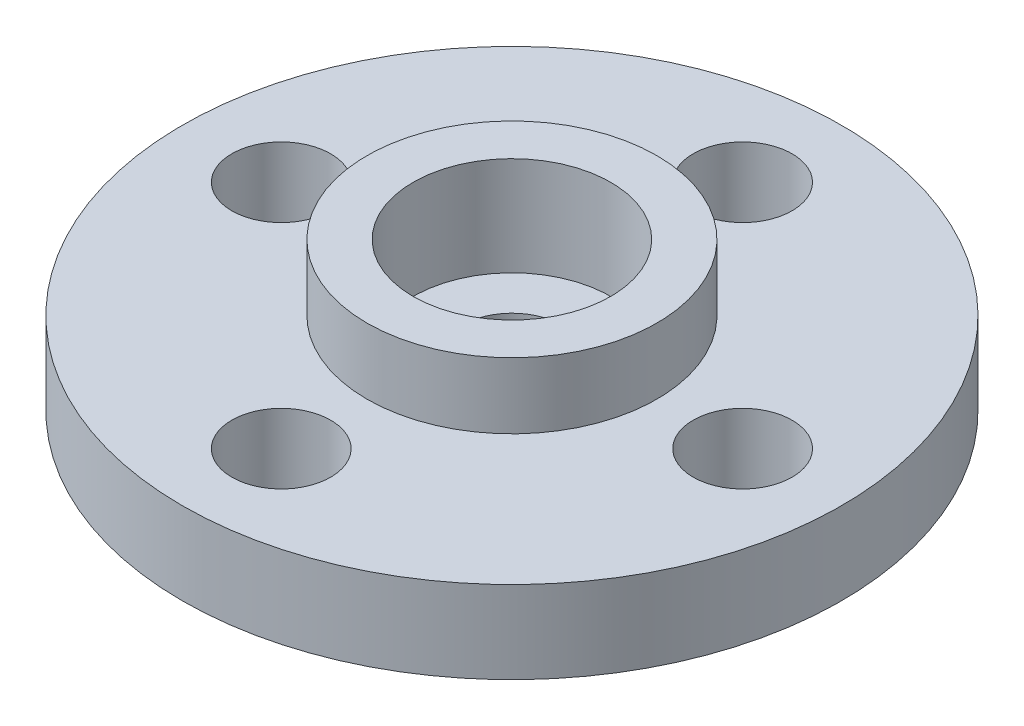
ISO-10303-21;
HEADER;
FILE_DESCRIPTION(('STEP AP214'),'2;1');
FILE_NAME('part.step','',(''),(''),'','','');
FILE_SCHEMA(('AUTOMOTIVE_DESIGN { 1 0 10303 214 1 1 1 1 }'));
ENDSEC;
DATA;
#1=APPLICATION_CONTEXT('core data for automotive mechanical design processes');
#2=APPLICATION_PROTOCOL_DEFINITION('international standard','automotive_design',2000,#1);
#3=PRODUCT_CONTEXT('',#1,'mechanical');
#4=PRODUCT('Part','Part','',(#3));
#5=PRODUCT_RELATED_PRODUCT_CATEGORY('part','',(#4));
#6=PRODUCT_DEFINITION_FORMATION('','',#4);
#7=PRODUCT_DEFINITION_CONTEXT('part definition',#1,'design');
#8=PRODUCT_DEFINITION('design','',#6,#7);
#9=PRODUCT_DEFINITION_SHAPE('','',#8);
#10=(LENGTH_UNIT() NAMED_UNIT(*) SI_UNIT(.MILLI.,.METRE.));
#11=(NAMED_UNIT(*) PLANE_ANGLE_UNIT() SI_UNIT($,.RADIAN.));
#12=(NAMED_UNIT(*) SI_UNIT($,.STERADIAN.) SOLID_ANGLE_UNIT());
#13=UNCERTAINTY_MEASURE_WITH_UNIT(LENGTH_MEASURE(1.E-05),#10,'distance_accuracy_value','');
#14=(GEOMETRIC_REPRESENTATION_CONTEXT(3) GLOBAL_UNCERTAINTY_ASSIGNED_CONTEXT((#13)) GLOBAL_UNIT_ASSIGNED_CONTEXT((#10,
#11,#12)) REPRESENTATION_CONTEXT('',''));
#15=CARTESIAN_POINT('',(0.,0.,0.));
#16=DIRECTION('',(0.,0.,1.));
#17=DIRECTION('',(1.,0.,0.));
#18=AXIS2_PLACEMENT_3D('',#15,#16,#17);
#19=CARTESIAN_POINT('',(0.,0.,0.));
#20=DIRECTION('',(0.,1.,0.));
#21=DIRECTION('',(0.,0.,1.));
#22=AXIS2_PLACEMENT_3D('',#19,#20,#21);
#23=CYLINDRICAL_SURFACE('',#22,1.5);
#24=CARTESIAN_POINT('',(0.,0.,0.));
#25=DIRECTION('',(0.,1.,0.));
#26=DIRECTION('',(0.,0.,1.));
#27=AXIS2_PLACEMENT_3D('',#24,#25,#26);
#28=CIRCLE('',#27,1.5);
#29=CARTESIAN_POINT('',(0.,0.,1.5));
#30=VERTEX_POINT('',#29);
#31=EDGE_CURVE('E49',#30,#30,#28,.T.);
#32=ORIENTED_EDGE('',*,*,#31,.F.);
#33=EDGE_LOOP('',(#32));
#34=FACE_BOUND('',#33,.T.);
#35=CARTESIAN_POINT('',(0.,1.5,0.));
#36=DIRECTION('',(0.,1.,0.));
#37=DIRECTION('',(0.,0.,1.));
#38=AXIS2_PLACEMENT_3D('',#35,#36,#37);
#39=CIRCLE('',#38,1.5);
#40=CARTESIAN_POINT('',(0.,1.5,1.5));
#41=VERTEX_POINT('',#40);
#42=EDGE_CURVE('E35',#41,#41,#39,.F.);
#43=ORIENTED_EDGE('',*,*,#42,.F.);
#44=EDGE_LOOP('',(#43));
#45=FACE_BOUND('',#44,.T.);
#46=ADVANCED_FACE('F31',(#34,#45),#23,.F.);
#47=CARTESIAN_POINT('',(0.,2.5,0.));
#48=DIRECTION('',(0.,1.,0.));
#49=DIRECTION('',(0.,0.,1.));
#50=AXIS2_PLACEMENT_3D('',#47,#48,#49);
#51=PLANE('',#50);
#52=CARTESIAN_POINT('',(0.,2.5,0.));
#53=DIRECTION('',(0.,1.,0.));
#54=DIRECTION('',(0.,0.,1.));
#55=AXIS2_PLACEMENT_3D('',#52,#53,#54);
#56=CIRCLE('',#55,10.);
#57=CARTESIAN_POINT('',(0.,2.5,10.));
#58=VERTEX_POINT('',#57);
#59=EDGE_CURVE('E10',#58,#58,#56,.T.);
#60=ORIENTED_EDGE('',*,*,#59,.T.);
#61=EDGE_LOOP('',(#60));
#62=FACE_BOUND('',#61,.T.);
#63=CARTESIAN_POINT('',(0.,2.5,-7.));
#64=DIRECTION('',(0.,1.,0.));
#65=DIRECTION('',(0.,0.,1.));
#66=AXIS2_PLACEMENT_3D('',#63,#64,#65);
#67=CIRCLE('',#66,1.5);
#68=CARTESIAN_POINT('',(0.,2.5,-5.5));
#69=VERTEX_POINT('',#68);
#70=EDGE_CURVE('E46',#69,#69,#67,.T.);
#71=ORIENTED_EDGE('',*,*,#70,.F.);
#72=EDGE_LOOP('',(#71));
#73=FACE_BOUND('',#72,.T.);
#74=CARTESIAN_POINT('',(7.,2.5,0.));
#75=DIRECTION('',(0.,1.,0.));
#76=DIRECTION('',(0.,0.,1.));
#77=AXIS2_PLACEMENT_3D('',#74,#75,#76);
#78=CIRCLE('',#77,1.5);
#79=CARTESIAN_POINT('',(7.,2.5,1.5));
#80=VERTEX_POINT('',#79);
#81=EDGE_CURVE('E55',#80,#80,#78,.T.);
#82=ORIENTED_EDGE('',*,*,#81,.F.);
#83=EDGE_LOOP('',(#82));
#84=FACE_BOUND('',#83,.T.);
#85=CARTESIAN_POINT('',(-7.,2.5,0.));
#86=DIRECTION('',(0.,1.,0.));
#87=DIRECTION('',(0.,0.,1.));
#88=AXIS2_PLACEMENT_3D('',#85,#86,#87);
#89=CIRCLE('',#88,1.5);
#90=CARTESIAN_POINT('',(-7.,2.5,1.5));
#91=VERTEX_POINT('',#90);
#92=EDGE_CURVE('E61',#91,#91,#89,.T.);
#93=ORIENTED_EDGE('',*,*,#92,.F.);
#94=EDGE_LOOP('',(#93));
#95=FACE_BOUND('',#94,.T.);
#96=CARTESIAN_POINT('',(0.,2.5,7.));
#97=DIRECTION('',(0.,1.,0.));
#98=DIRECTION('',(0.,0.,1.));
#99=AXIS2_PLACEMENT_3D('',#96,#97,#98);
#100=CIRCLE('',#99,1.5);
#101=CARTESIAN_POINT('',(0.,2.5,8.5));
#102=VERTEX_POINT('',#101);
#103=EDGE_CURVE('E67',#102,#102,#100,.T.);
#104=ORIENTED_EDGE('',*,*,#103,.F.);
#105=EDGE_LOOP('',(#104));
#106=FACE_BOUND('',#105,.T.);
#107=CARTESIAN_POINT('',(0.,2.5,0.));
#108=DIRECTION('',(0.,1.,0.));
#109=DIRECTION('',(0.,0.,1.));
#110=AXIS2_PLACEMENT_3D('',#107,#108,#109);
#111=CIRCLE('',#110,4.4);
#112=CARTESIAN_POINT('',(0.,2.5,4.4));
#113=VERTEX_POINT('',#112);
#114=EDGE_CURVE('E73',#113,#113,#111,.T.);
#115=ORIENTED_EDGE('',*,*,#114,.F.);
#116=EDGE_LOOP('',(#115));
#117=FACE_BOUND('',#116,.T.);
#118=ADVANCED_FACE('F91',(#62,#73,#84,#95,#106,#117),#51,.T.);
#119=CARTESIAN_POINT('',(0.,2.5,0.));
#120=DIRECTION('',(0.,-1.,0.));
#121=DIRECTION('',(0.,0.,-1.));
#122=AXIS2_PLACEMENT_3D('',#119,#120,#121);
#123=CYLINDRICAL_SURFACE('',#122,10.);
#124=ORIENTED_EDGE('',*,*,#59,.F.);
#125=EDGE_LOOP('',(#124));
#126=FACE_BOUND('',#125,.T.);
#127=CARTESIAN_POINT('',(0.,0.,0.));
#128=DIRECTION('',(0.,1.,0.));
#129=DIRECTION('',(0.,0.,1.));
#130=AXIS2_PLACEMENT_3D('',#127,#128,#129);
#131=CIRCLE('',#130,10.);
#132=CARTESIAN_POINT('',(0.,0.,10.));
#133=VERTEX_POINT('',#132);
#134=EDGE_CURVE('E39',#133,#133,#131,.T.);
#135=ORIENTED_EDGE('',*,*,#134,.T.);
#136=EDGE_LOOP('',(#135));
#137=FACE_BOUND('',#136,.T.);
#138=ADVANCED_FACE('F33',(#126,#137),#123,.T.);
#139=CARTESIAN_POINT('',(0.,0.,0.));
#140=DIRECTION('',(0.,1.,0.));
#141=DIRECTION('',(0.,0.,1.));
#142=AXIS2_PLACEMENT_3D('',#139,#140,#141);
#143=PLANE('',#142);
#144=CARTESIAN_POINT('',(0.,0.,7.));
#145=DIRECTION('',(0.,1.,0.));
#146=DIRECTION('',(0.,0.,1.));
#147=AXIS2_PLACEMENT_3D('',#144,#145,#146);
#148=CIRCLE('',#147,1.5);
#149=CARTESIAN_POINT('',(0.,0.,8.5));
#150=VERTEX_POINT('',#149);
#151=EDGE_CURVE('E64',#150,#150,#148,.T.);
#152=ORIENTED_EDGE('',*,*,#151,.T.);
#153=EDGE_LOOP('',(#152));
#154=FACE_BOUND('',#153,.T.);
#155=CARTESIAN_POINT('',(-7.,0.,0.));
#156=DIRECTION('',(0.,1.,0.));
#157=DIRECTION('',(0.,0.,1.));
#158=AXIS2_PLACEMENT_3D('',#155,#156,#157);
#159=CIRCLE('',#158,1.5);
#160=CARTESIAN_POINT('',(-7.,0.,1.5));
#161=VERTEX_POINT('',#160);
#162=EDGE_CURVE('E58',#161,#161,#159,.T.);
#163=ORIENTED_EDGE('',*,*,#162,.T.);
#164=EDGE_LOOP('',(#163));
#165=FACE_BOUND('',#164,.T.);
#166=CARTESIAN_POINT('',(7.,0.,0.));
#167=DIRECTION('',(0.,1.,0.));
#168=DIRECTION('',(0.,0.,1.));
#169=AXIS2_PLACEMENT_3D('',#166,#167,#168);
#170=CIRCLE('',#169,1.5);
#171=CARTESIAN_POINT('',(7.,0.,1.5));
#172=VERTEX_POINT('',#171);
#173=EDGE_CURVE('E54',#172,#172,#170,.T.);
#174=ORIENTED_EDGE('',*,*,#173,.T.);
#175=EDGE_LOOP('',(#174));
#176=FACE_BOUND('',#175,.T.);
#177=ORIENTED_EDGE('',*,*,#31,.T.);
#178=EDGE_LOOP('',(#177));
#179=FACE_BOUND('',#178,.T.);
#180=CARTESIAN_POINT('',(0.,0.,-7.));
#181=DIRECTION('',(0.,1.,0.));
#182=DIRECTION('',(0.,0.,1.));
#183=AXIS2_PLACEMENT_3D('',#180,#181,#182);
#184=CIRCLE('',#183,1.5);
#185=CARTESIAN_POINT('',(0.,0.,-5.5));
#186=VERTEX_POINT('',#185);
#187=EDGE_CURVE('E44',#186,#186,#184,.T.);
#188=ORIENTED_EDGE('',*,*,#187,.T.);
#189=EDGE_LOOP('',(#188));
#190=FACE_BOUND('',#189,.T.);
#191=ORIENTED_EDGE('',*,*,#134,.F.);
#192=EDGE_LOOP('',(#191));
#193=FACE_BOUND('',#192,.T.);
#194=ADVANCED_FACE('F105',(#154,#165,#176,#179,#190,#193),#143,.F.);
#195=CARTESIAN_POINT('',(0.,0.,-7.));
#196=DIRECTION('',(0.,1.,0.));
#197=DIRECTION('',(0.,0.,1.));
#198=AXIS2_PLACEMENT_3D('',#195,#196,#197);
#199=CYLINDRICAL_SURFACE('',#198,1.5);
#200=ORIENTED_EDGE('',*,*,#187,.F.);
#201=EDGE_LOOP('',(#200));
#202=FACE_BOUND('',#201,.T.);
#203=ORIENTED_EDGE('',*,*,#70,.T.);
#204=EDGE_LOOP('',(#203));
#205=FACE_BOUND('',#204,.T.);
#206=ADVANCED_FACE('F103',(#202,#205),#199,.F.);
#207=CARTESIAN_POINT('',(7.,0.,0.));
#208=DIRECTION('',(0.,1.,0.));
#209=DIRECTION('',(0.,0.,1.));
#210=AXIS2_PLACEMENT_3D('',#207,#208,#209);
#211=CYLINDRICAL_SURFACE('',#210,1.5);
#212=ORIENTED_EDGE('',*,*,#173,.F.);
#213=EDGE_LOOP('',(#212));
#214=FACE_BOUND('',#213,.T.);
#215=ORIENTED_EDGE('',*,*,#81,.T.);
#216=EDGE_LOOP('',(#215));
#217=FACE_BOUND('',#216,.T.);
#218=ADVANCED_FACE('F101',(#214,#217),#211,.F.);
#219=CARTESIAN_POINT('',(-7.,0.,0.));
#220=DIRECTION('',(0.,1.,0.));
#221=DIRECTION('',(0.,0.,1.));
#222=AXIS2_PLACEMENT_3D('',#219,#220,#221);
#223=CYLINDRICAL_SURFACE('',#222,1.5);
#224=ORIENTED_EDGE('',*,*,#162,.F.);
#225=EDGE_LOOP('',(#224));
#226=FACE_BOUND('',#225,.T.);
#227=ORIENTED_EDGE('',*,*,#92,.T.);
#228=EDGE_LOOP('',(#227));
#229=FACE_BOUND('',#228,.T.);
#230=ADVANCED_FACE('F148',(#226,#229),#223,.F.);
#231=CARTESIAN_POINT('',(0.,0.,7.));
#232=DIRECTION('',(0.,1.,0.));
#233=DIRECTION('',(0.,0.,1.));
#234=AXIS2_PLACEMENT_3D('',#231,#232,#233);
#235=CYLINDRICAL_SURFACE('',#234,1.5);
#236=ORIENTED_EDGE('',*,*,#151,.F.);
#237=EDGE_LOOP('',(#236));
#238=FACE_BOUND('',#237,.T.);
#239=ORIENTED_EDGE('',*,*,#103,.T.);
#240=EDGE_LOOP('',(#239));
#241=FACE_BOUND('',#240,.T.);
#242=ADVANCED_FACE('F139',(#238,#241),#235,.F.);
#243=CARTESIAN_POINT('',(0.,4.5,0.));
#244=DIRECTION('',(0.,-1.,0.));
#245=DIRECTION('',(0.,0.,-1.));
#246=AXIS2_PLACEMENT_3D('',#243,#244,#245);
#247=CYLINDRICAL_SURFACE('',#246,4.4);
#248=CARTESIAN_POINT('',(0.,4.5,0.));
#249=DIRECTION('',(0.,1.,0.));
#250=DIRECTION('',(0.,0.,1.));
#251=AXIS2_PLACEMENT_3D('',#248,#249,#250);
#252=CIRCLE('',#251,4.4);
#253=CARTESIAN_POINT('',(0.,4.5,4.4));
#254=VERTEX_POINT('',#253);
#255=EDGE_CURVE('E70',#254,#254,#252,.T.);
#256=ORIENTED_EDGE('',*,*,#255,.F.);
#257=EDGE_LOOP('',(#256));
#258=FACE_BOUND('',#257,.T.);
#259=ORIENTED_EDGE('',*,*,#114,.T.);
#260=EDGE_LOOP('',(#259));
#261=FACE_BOUND('',#260,.T.);
#262=ADVANCED_FACE('F136',(#258,#261),#247,.T.);
#263=CARTESIAN_POINT('',(0.,4.5,0.));
#264=DIRECTION('',(0.,1.,0.));
#265=DIRECTION('',(0.,0.,1.));
#266=AXIS2_PLACEMENT_3D('',#263,#264,#265);
#267=PLANE('',#266);
#268=CARTESIAN_POINT('',(0.,4.5,0.));
#269=DIRECTION('',(0.,1.,0.));
#270=DIRECTION('',(0.,0.,1.));
#271=AXIS2_PLACEMENT_3D('',#268,#269,#270);
#272=CIRCLE('',#271,3.);
#273=CARTESIAN_POINT('',(0.,4.5,3.));
#274=VERTEX_POINT('',#273);
#275=EDGE_CURVE('E78',#274,#274,#272,.T.);
#276=ORIENTED_EDGE('',*,*,#275,.F.);
#277=EDGE_LOOP('',(#276));
#278=FACE_BOUND('',#277,.T.);
#279=ORIENTED_EDGE('',*,*,#255,.T.);
#280=EDGE_LOOP('',(#279));
#281=FACE_BOUND('',#280,.T.);
#282=ADVANCED_FACE('F138',(#278,#281),#267,.T.);
#283=CARTESIAN_POINT('',(0.,1.5,0.));
#284=DIRECTION('',(0.,1.,0.));
#285=DIRECTION('',(0.,0.,1.));
#286=AXIS2_PLACEMENT_3D('',#283,#284,#285);
#287=PLANE('',#286);
#288=CARTESIAN_POINT('',(0.,1.5,0.));
#289=DIRECTION('',(0.,1.,0.));
#290=DIRECTION('',(0.,0.,1.));
#291=AXIS2_PLACEMENT_3D('',#288,#289,#290);
#292=CIRCLE('',#291,3.);
#293=CARTESIAN_POINT('',(0.,1.5,3.));
#294=VERTEX_POINT('',#293);
#295=EDGE_CURVE('E81',#294,#294,#292,.T.);
#296=ORIENTED_EDGE('',*,*,#295,.T.);
#297=EDGE_LOOP('',(#296));
#298=FACE_BOUND('',#297,.T.);
#299=ORIENTED_EDGE('',*,*,#42,.T.);
#300=EDGE_LOOP('',(#299));
#301=FACE_BOUND('',#300,.T.);
#302=ADVANCED_FACE('F88',(#298,#301),#287,.T.);
#303=CARTESIAN_POINT('',(0.,1.5,0.));
#304=DIRECTION('',(0.,1.,0.));
#305=DIRECTION('',(0.,0.,1.));
#306=AXIS2_PLACEMENT_3D('',#303,#304,#305);
#307=CYLINDRICAL_SURFACE('',#306,3.);
#308=ORIENTED_EDGE('',*,*,#295,.F.);
#309=EDGE_LOOP('',(#308));
#310=FACE_BOUND('',#309,.T.);
#311=ORIENTED_EDGE('',*,*,#275,.T.);
#312=EDGE_LOOP('',(#311));
#313=FACE_BOUND('',#312,.T.);
#314=ADVANCED_FACE('F209',(#310,#313),#307,.F.);
#315=CLOSED_SHELL('',(#46,#118,#138,#194,#206,#218,#230,#242,#262,#282,#302,#314));
#316=MANIFOLD_SOLID_BREP('B2',#315);
#317=ADVANCED_BREP_SHAPE_REPRESENTATION('',(#18,#316),#14);
#318=SHAPE_DEFINITION_REPRESENTATION(#9,#317);
ENDSEC;
END-ISO-10303-21;
